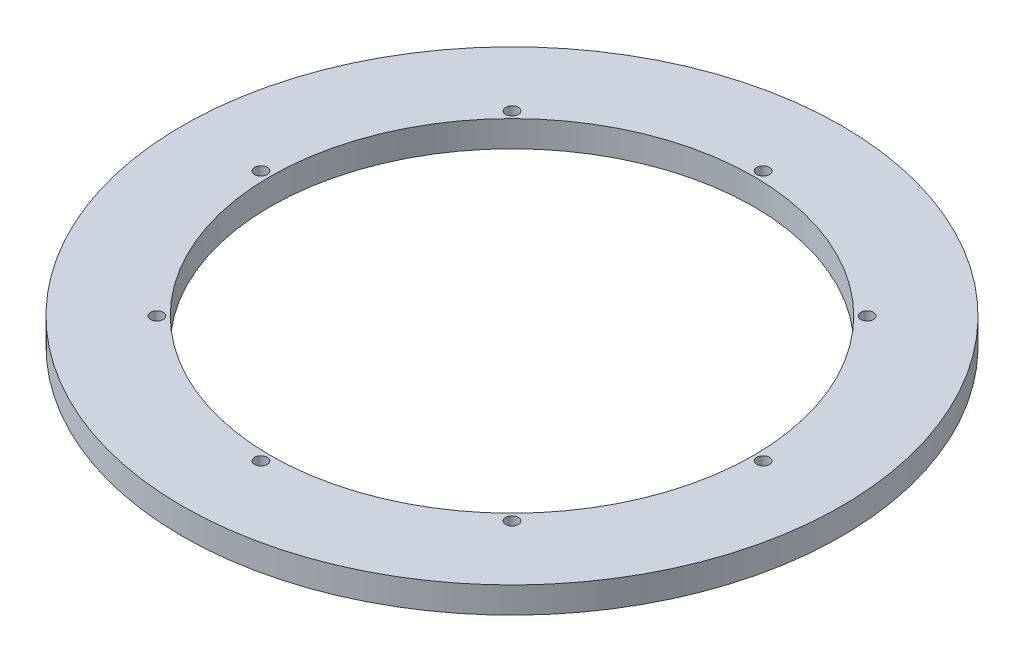
ISO-10303-21;
HEADER;
FILE_DESCRIPTION(('STEP AP214'),'2;1');
FILE_NAME('part.step','',(''),(''),'','','');
FILE_SCHEMA(('AUTOMOTIVE_DESIGN { 1 0 10303 214 1 1 1 1 }'));
ENDSEC;
DATA;
#1=APPLICATION_CONTEXT('core data for automotive mechanical design processes');
#2=APPLICATION_PROTOCOL_DEFINITION('international standard','automotive_design',2000,#1);
#3=PRODUCT_CONTEXT('',#1,'mechanical');
#4=PRODUCT('Part','Part','',(#3));
#5=PRODUCT_RELATED_PRODUCT_CATEGORY('part','',(#4));
#6=PRODUCT_DEFINITION_FORMATION('','',#4);
#7=PRODUCT_DEFINITION_CONTEXT('part definition',#1,'design');
#8=PRODUCT_DEFINITION('design','',#6,#7);
#9=PRODUCT_DEFINITION_SHAPE('','',#8);
#10=(LENGTH_UNIT() NAMED_UNIT(*) SI_UNIT(.MILLI.,.METRE.));
#11=(NAMED_UNIT(*) PLANE_ANGLE_UNIT() SI_UNIT($,.RADIAN.));
#12=(NAMED_UNIT(*) SI_UNIT($,.STERADIAN.) SOLID_ANGLE_UNIT());
#13=UNCERTAINTY_MEASURE_WITH_UNIT(LENGTH_MEASURE(1.E-05),#10,'distance_accuracy_value','');
#14=(GEOMETRIC_REPRESENTATION_CONTEXT(3) GLOBAL_UNCERTAINTY_ASSIGNED_CONTEXT((#13)) GLOBAL_UNIT_ASSIGNED_CONTEXT((#10,
#11,#12)) REPRESENTATION_CONTEXT('',''));
#15=CARTESIAN_POINT('',(0.,0.,0.));
#16=DIRECTION('',(0.,0.,1.));
#17=DIRECTION('',(1.,0.,0.));
#18=AXIS2_PLACEMENT_3D('',#15,#16,#17);
#19=CARTESIAN_POINT('',(0.,12.5,0.));
#20=DIRECTION('',(0.,1.,0.));
#21=DIRECTION('',(0.,0.,1.));
#22=AXIS2_PLACEMENT_3D('',#19,#20,#21);
#23=PLANE('',#22);
#24=CARTESIAN_POINT('',(-240.,12.5,-2.51386656396706E-12));
#25=DIRECTION('',(0.,1.,0.));
#26=DIRECTION('',(0.,0.,1.));
#27=AXIS2_PLACEMENT_3D('',#24,#25,#26);
#28=CIRCLE('',#27,6.);
#29=CARTESIAN_POINT('',(-240.,12.5,5.99999999999749));
#30=VERTEX_POINT('',#29);
#31=EDGE_CURVE('E82',#30,#30,#28,.T.);
#32=ORIENTED_EDGE('',*,*,#31,.F.);
#33=EDGE_LOOP('',(#32));
#34=FACE_BOUND('',#33,.T.);
#35=CARTESIAN_POINT('',(-1.6759110426447E-12,12.5,240.));
#36=DIRECTION('',(0.,1.,0.));
#37=DIRECTION('',(0.,0.,1.));
#38=AXIS2_PLACEMENT_3D('',#35,#36,#37);
#39=CIRCLE('',#38,6.00000000000001);
#40=CARTESIAN_POINT('',(-1.6759110426447E-12,12.5,246.));
#41=VERTEX_POINT('',#40);
#42=EDGE_CURVE('E70',#41,#41,#39,.T.);
#43=ORIENTED_EDGE('',*,*,#42,.F.);
#44=EDGE_LOOP('',(#43));
#45=FACE_BOUND('',#44,.T.);
#46=CARTESIAN_POINT('',(240.,12.5,8.37955521322352E-13));
#47=DIRECTION('',(0.,1.,0.));
#48=DIRECTION('',(0.,0.,1.));
#49=AXIS2_PLACEMENT_3D('',#46,#47,#48);
#50=CIRCLE('',#49,6.);
#51=CARTESIAN_POINT('',(240.,12.5,6.00000000000084));
#52=VERTEX_POINT('',#51);
#53=EDGE_CURVE('E58',#52,#52,#50,.T.);
#54=ORIENTED_EDGE('',*,*,#53,.F.);
#55=EDGE_LOOP('',(#54));
#56=FACE_BOUND('',#55,.T.);
#57=CARTESIAN_POINT('',(0.,12.5,-240.));
#58=DIRECTION('',(0.,1.,0.));
#59=DIRECTION('',(0.,0.,1.));
#60=AXIS2_PLACEMENT_3D('',#57,#58,#59);
#61=CIRCLE('',#60,6.);
#62=CARTESIAN_POINT('',(0.,12.5,-234.));
#63=VERTEX_POINT('',#62);
#64=EDGE_CURVE('E46',#63,#63,#61,.T.);
#65=ORIENTED_EDGE('',*,*,#64,.F.);
#66=EDGE_LOOP('',(#65));
#67=FACE_BOUND('',#66,.T.);
#68=CARTESIAN_POINT('',(0.,12.5,0.));
#69=DIRECTION('',(0.,1.,0.));
#70=DIRECTION('',(0.,0.,1.));
#71=AXIS2_PLACEMENT_3D('',#68,#69,#70);
#72=CIRCLE('',#71,315.);
#73=CARTESIAN_POINT('',(0.,12.5,315.));
#74=VERTEX_POINT('',#73);
#75=EDGE_CURVE('E10',#74,#74,#72,.T.);
#76=ORIENTED_EDGE('',*,*,#75,.T.);
#77=EDGE_LOOP('',(#76));
#78=FACE_BOUND('',#77,.T.);
#79=CARTESIAN_POINT('',(0.,12.5,0.));
#80=DIRECTION('',(0.,1.,0.));
#81=DIRECTION('',(0.,0.,1.));
#82=AXIS2_PLACEMENT_3D('',#79,#80,#81);
#83=CIRCLE('',#82,231.);
#84=CARTESIAN_POINT('',(0.,12.5,231.));
#85=VERTEX_POINT('',#84);
#86=EDGE_CURVE('E41',#85,#85,#83,.T.);
#87=ORIENTED_EDGE('',*,*,#86,.F.);
#88=EDGE_LOOP('',(#87));
#89=FACE_BOUND('',#88,.T.);
#90=CARTESIAN_POINT('',(169.705627484772,12.5,-169.705627484771));
#91=DIRECTION('',(0.,1.,0.));
#92=DIRECTION('',(0.,0.,1.));
#93=AXIS2_PLACEMENT_3D('',#90,#91,#92);
#94=CIRCLE('',#93,5.99999999999998);
#95=CARTESIAN_POINT('',(169.705627484772,12.5,-163.705627484771));
#96=VERTEX_POINT('',#95);
#97=EDGE_CURVE('E52',#96,#96,#94,.T.);
#98=ORIENTED_EDGE('',*,*,#97,.F.);
#99=EDGE_LOOP('',(#98));
#100=FACE_BOUND('',#99,.T.);
#101=CARTESIAN_POINT('',(169.70562748477,12.5,169.705627484772));
#102=DIRECTION('',(0.,1.,0.));
#103=DIRECTION('',(0.,0.,1.));
#104=AXIS2_PLACEMENT_3D('',#101,#102,#103);
#105=CIRCLE('',#104,5.99999999999998);
#106=CARTESIAN_POINT('',(169.70562748477,12.5,175.705627484772));
#107=VERTEX_POINT('',#106);
#108=EDGE_CURVE('E64',#107,#107,#105,.T.);
#109=ORIENTED_EDGE('',*,*,#108,.F.);
#110=EDGE_LOOP('',(#109));
#111=FACE_BOUND('',#110,.T.);
#112=CARTESIAN_POINT('',(-169.705627484773,12.5,169.70562748477));
#113=DIRECTION('',(0.,1.,0.));
#114=DIRECTION('',(0.,0.,1.));
#115=AXIS2_PLACEMENT_3D('',#112,#113,#114);
#116=CIRCLE('',#115,6.00000000000001);
#117=CARTESIAN_POINT('',(-169.705627484773,12.5,175.70562748477));
#118=VERTEX_POINT('',#117);
#119=EDGE_CURVE('E76',#118,#118,#116,.T.);
#120=ORIENTED_EDGE('',*,*,#119,.F.);
#121=EDGE_LOOP('',(#120));
#122=FACE_BOUND('',#121,.T.);
#123=CARTESIAN_POINT('',(-169.705627484769,12.5,-169.705627484773));
#124=DIRECTION('',(0.,1.,0.));
#125=DIRECTION('',(0.,0.,1.));
#126=AXIS2_PLACEMENT_3D('',#123,#124,#125);
#127=CIRCLE('',#126,6.00000000000001);
#128=CARTESIAN_POINT('',(-169.705627484769,12.5,-163.705627484773));
#129=VERTEX_POINT('',#128);
#130=EDGE_CURVE('E88',#129,#129,#127,.T.);
#131=ORIENTED_EDGE('',*,*,#130,.F.);
#132=EDGE_LOOP('',(#131));
#133=FACE_BOUND('',#132,.T.);
#134=ADVANCED_FACE('F30',(#34,#45,#56,#67,#78,#89,#100,#111,#122,#133),#23,.T.);
#135=CARTESIAN_POINT('',(0.,-12.5,0.));
#136=DIRECTION('',(0.,1.,0.));
#137=DIRECTION('',(0.,0.,1.));
#138=AXIS2_PLACEMENT_3D('',#135,#136,#137);
#139=PLANE('',#138);
#140=CARTESIAN_POINT('',(0.,-12.5,0.));
#141=DIRECTION('',(0.,1.,0.));
#142=DIRECTION('',(0.,0.,1.));
#143=AXIS2_PLACEMENT_3D('',#140,#141,#142);
#144=CIRCLE('',#143,315.);
#145=CARTESIAN_POINT('',(0.,-12.5,315.));
#146=VERTEX_POINT('',#145);
#147=EDGE_CURVE('E34',#146,#146,#144,.T.);
#148=ORIENTED_EDGE('',*,*,#147,.F.);
#149=EDGE_LOOP('',(#148));
#150=FACE_BOUND('',#149,.T.);
#151=CARTESIAN_POINT('',(0.,-12.5,0.));
#152=DIRECTION('',(0.,1.,0.));
#153=DIRECTION('',(0.,0.,1.));
#154=AXIS2_PLACEMENT_3D('',#151,#152,#153);
#155=CIRCLE('',#154,231.);
#156=CARTESIAN_POINT('',(0.,-12.5,231.));
#157=VERTEX_POINT('',#156);
#158=EDGE_CURVE('E43',#157,#157,#155,.T.);
#159=ORIENTED_EDGE('',*,*,#158,.T.);
#160=EDGE_LOOP('',(#159));
#161=FACE_BOUND('',#160,.T.);
#162=CARTESIAN_POINT('',(0.,-12.5,-240.));
#163=DIRECTION('',(0.,1.,0.));
#164=DIRECTION('',(0.,0.,1.));
#165=AXIS2_PLACEMENT_3D('',#162,#163,#164);
#166=CIRCLE('',#165,6.);
#167=CARTESIAN_POINT('',(0.,-12.5,-234.));
#168=VERTEX_POINT('',#167);
#169=EDGE_CURVE('E49',#168,#168,#166,.T.);
#170=ORIENTED_EDGE('',*,*,#169,.T.);
#171=EDGE_LOOP('',(#170));
#172=FACE_BOUND('',#171,.T.);
#173=CARTESIAN_POINT('',(169.705627484772,-12.5,-169.705627484771));
#174=DIRECTION('',(0.,1.,0.));
#175=DIRECTION('',(0.,0.,1.));
#176=AXIS2_PLACEMENT_3D('',#173,#174,#175);
#177=CIRCLE('',#176,5.99999999999998);
#178=CARTESIAN_POINT('',(169.705627484772,-12.5,-163.705627484771));
#179=VERTEX_POINT('',#178);
#180=EDGE_CURVE('E55',#179,#179,#177,.T.);
#181=ORIENTED_EDGE('',*,*,#180,.T.);
#182=EDGE_LOOP('',(#181));
#183=FACE_BOUND('',#182,.T.);
#184=CARTESIAN_POINT('',(240.,-12.5,8.37955521322352E-13));
#185=DIRECTION('',(0.,1.,0.));
#186=DIRECTION('',(0.,0.,1.));
#187=AXIS2_PLACEMENT_3D('',#184,#185,#186);
#188=CIRCLE('',#187,6.);
#189=CARTESIAN_POINT('',(240.,-12.5,6.00000000000084));
#190=VERTEX_POINT('',#189);
#191=EDGE_CURVE('E61',#190,#190,#188,.T.);
#192=ORIENTED_EDGE('',*,*,#191,.T.);
#193=EDGE_LOOP('',(#192));
#194=FACE_BOUND('',#193,.T.);
#195=CARTESIAN_POINT('',(169.70562748477,-12.5,169.705627484772));
#196=DIRECTION('',(0.,1.,0.));
#197=DIRECTION('',(0.,0.,1.));
#198=AXIS2_PLACEMENT_3D('',#195,#196,#197);
#199=CIRCLE('',#198,5.99999999999998);
#200=CARTESIAN_POINT('',(169.70562748477,-12.5,175.705627484772));
#201=VERTEX_POINT('',#200);
#202=EDGE_CURVE('E67',#201,#201,#199,.T.);
#203=ORIENTED_EDGE('',*,*,#202,.T.);
#204=EDGE_LOOP('',(#203));
#205=FACE_BOUND('',#204,.T.);
#206=CARTESIAN_POINT('',(-1.6759110426447E-12,-12.5,240.));
#207=DIRECTION('',(0.,1.,0.));
#208=DIRECTION('',(0.,0.,1.));
#209=AXIS2_PLACEMENT_3D('',#206,#207,#208);
#210=CIRCLE('',#209,6.00000000000001);
#211=CARTESIAN_POINT('',(-1.6759110426447E-12,-12.5,246.));
#212=VERTEX_POINT('',#211);
#213=EDGE_CURVE('E73',#212,#212,#210,.T.);
#214=ORIENTED_EDGE('',*,*,#213,.T.);
#215=EDGE_LOOP('',(#214));
#216=FACE_BOUND('',#215,.T.);
#217=CARTESIAN_POINT('',(-169.705627484773,-12.5,169.70562748477));
#218=DIRECTION('',(0.,1.,0.));
#219=DIRECTION('',(0.,0.,1.));
#220=AXIS2_PLACEMENT_3D('',#217,#218,#219);
#221=CIRCLE('',#220,6.00000000000001);
#222=CARTESIAN_POINT('',(-169.705627484773,-12.5,175.70562748477));
#223=VERTEX_POINT('',#222);
#224=EDGE_CURVE('E79',#223,#223,#221,.T.);
#225=ORIENTED_EDGE('',*,*,#224,.T.);
#226=EDGE_LOOP('',(#225));
#227=FACE_BOUND('',#226,.T.);
#228=CARTESIAN_POINT('',(-240.,-12.5,-2.51386656396706E-12));
#229=DIRECTION('',(0.,1.,0.));
#230=DIRECTION('',(0.,0.,1.));
#231=AXIS2_PLACEMENT_3D('',#228,#229,#230);
#232=CIRCLE('',#231,6.);
#233=CARTESIAN_POINT('',(-240.,-12.5,5.99999999999749));
#234=VERTEX_POINT('',#233);
#235=EDGE_CURVE('E85',#234,#234,#232,.T.);
#236=ORIENTED_EDGE('',*,*,#235,.T.);
#237=EDGE_LOOP('',(#236));
#238=FACE_BOUND('',#237,.T.);
#239=CARTESIAN_POINT('',(-169.705627484769,-12.5,-169.705627484773));
#240=DIRECTION('',(0.,1.,0.));
#241=DIRECTION('',(0.,0.,1.));
#242=AXIS2_PLACEMENT_3D('',#239,#240,#241);
#243=CIRCLE('',#242,6.00000000000001);
#244=CARTESIAN_POINT('',(-169.705627484769,-12.5,-163.705627484773));
#245=VERTEX_POINT('',#244);
#246=EDGE_CURVE('E91',#245,#245,#243,.T.);
#247=ORIENTED_EDGE('',*,*,#246,.T.);
#248=EDGE_LOOP('',(#247));
#249=FACE_BOUND('',#248,.T.);
#250=ADVANCED_FACE('F101',(#150,#161,#172,#183,#194,#205,#216,#227,#238,#249),#139,.F.);
#251=CARTESIAN_POINT('',(0.,12.5,0.));
#252=DIRECTION('',(0.,-1.,0.));
#253=DIRECTION('',(0.,0.,-1.));
#254=AXIS2_PLACEMENT_3D('',#251,#252,#253);
#255=CYLINDRICAL_SURFACE('',#254,315.);
#256=ORIENTED_EDGE('',*,*,#75,.F.);
#257=EDGE_LOOP('',(#256));
#258=FACE_BOUND('',#257,.T.);
#259=ORIENTED_EDGE('',*,*,#147,.T.);
#260=EDGE_LOOP('',(#259));
#261=FACE_BOUND('',#260,.T.);
#262=ADVANCED_FACE('F32',(#258,#261),#255,.T.);
#263=CARTESIAN_POINT('',(0.,12.5,0.));
#264=DIRECTION('',(0.,-1.,0.));
#265=DIRECTION('',(0.,0.,-1.));
#266=AXIS2_PLACEMENT_3D('',#263,#264,#265);
#267=CYLINDRICAL_SURFACE('',#266,231.);
#268=ORIENTED_EDGE('',*,*,#86,.T.);
#269=EDGE_LOOP('',(#268));
#270=FACE_BOUND('',#269,.T.);
#271=ORIENTED_EDGE('',*,*,#158,.F.);
#272=EDGE_LOOP('',(#271));
#273=FACE_BOUND('',#272,.T.);
#274=ADVANCED_FACE('F111',(#270,#273),#267,.F.);
#275=CARTESIAN_POINT('',(0.,12.5,-240.));
#276=DIRECTION('',(0.,-1.,0.));
#277=DIRECTION('',(0.,0.,-1.));
#278=AXIS2_PLACEMENT_3D('',#275,#276,#277);
#279=CYLINDRICAL_SURFACE('',#278,6.);
#280=ORIENTED_EDGE('',*,*,#64,.T.);
#281=EDGE_LOOP('',(#280));
#282=FACE_BOUND('',#281,.T.);
#283=ORIENTED_EDGE('',*,*,#169,.F.);
#284=EDGE_LOOP('',(#283));
#285=FACE_BOUND('',#284,.T.);
#286=ADVANCED_FACE('F114',(#282,#285),#279,.F.);
#287=CARTESIAN_POINT('',(169.705627484772,12.5,-169.705627484771));
#288=DIRECTION('',(0.,-1.,0.));
#289=DIRECTION('',(0.,0.,-1.));
#290=AXIS2_PLACEMENT_3D('',#287,#288,#289);
#291=CYLINDRICAL_SURFACE('',#290,5.99999999999998);
#292=ORIENTED_EDGE('',*,*,#97,.T.);
#293=EDGE_LOOP('',(#292));
#294=FACE_BOUND('',#293,.T.);
#295=ORIENTED_EDGE('',*,*,#180,.F.);
#296=EDGE_LOOP('',(#295));
#297=FACE_BOUND('',#296,.T.);
#298=ADVANCED_FACE('F118',(#294,#297),#291,.F.);
#299=CARTESIAN_POINT('',(240.,12.5,8.37955521322352E-13));
#300=DIRECTION('',(0.,-1.,0.));
#301=DIRECTION('',(0.,0.,-1.));
#302=AXIS2_PLACEMENT_3D('',#299,#300,#301);
#303=CYLINDRICAL_SURFACE('',#302,6.);
#304=ORIENTED_EDGE('',*,*,#53,.T.);
#305=EDGE_LOOP('',(#304));
#306=FACE_BOUND('',#305,.T.);
#307=ORIENTED_EDGE('',*,*,#191,.F.);
#308=EDGE_LOOP('',(#307));
#309=FACE_BOUND('',#308,.T.);
#310=ADVANCED_FACE('F122',(#306,#309),#303,.F.);
#311=CARTESIAN_POINT('',(169.70562748477,12.5,169.705627484772));
#312=DIRECTION('',(0.,-1.,0.));
#313=DIRECTION('',(0.,0.,-1.));
#314=AXIS2_PLACEMENT_3D('',#311,#312,#313);
#315=CYLINDRICAL_SURFACE('',#314,5.99999999999998);
#316=ORIENTED_EDGE('',*,*,#108,.T.);
#317=EDGE_LOOP('',(#316));
#318=FACE_BOUND('',#317,.T.);
#319=ORIENTED_EDGE('',*,*,#202,.F.);
#320=EDGE_LOOP('',(#319));
#321=FACE_BOUND('',#320,.T.);
#322=ADVANCED_FACE('F126',(#318,#321),#315,.F.);
#323=CARTESIAN_POINT('',(-1.6759110426447E-12,12.5,240.));
#324=DIRECTION('',(0.,-1.,0.));
#325=DIRECTION('',(0.,0.,-1.));
#326=AXIS2_PLACEMENT_3D('',#323,#324,#325);
#327=CYLINDRICAL_SURFACE('',#326,6.00000000000001);
#328=ORIENTED_EDGE('',*,*,#42,.T.);
#329=EDGE_LOOP('',(#328));
#330=FACE_BOUND('',#329,.T.);
#331=ORIENTED_EDGE('',*,*,#213,.F.);
#332=EDGE_LOOP('',(#331));
#333=FACE_BOUND('',#332,.T.);
#334=ADVANCED_FACE('F130',(#330,#333),#327,.F.);
#335=CARTESIAN_POINT('',(-169.705627484773,12.5,169.70562748477));
#336=DIRECTION('',(0.,-1.,0.));
#337=DIRECTION('',(0.,0.,-1.));
#338=AXIS2_PLACEMENT_3D('',#335,#336,#337);
#339=CYLINDRICAL_SURFACE('',#338,6.00000000000001);
#340=ORIENTED_EDGE('',*,*,#119,.T.);
#341=EDGE_LOOP('',(#340));
#342=FACE_BOUND('',#341,.T.);
#343=ORIENTED_EDGE('',*,*,#224,.F.);
#344=EDGE_LOOP('',(#343));
#345=FACE_BOUND('',#344,.T.);
#346=ADVANCED_FACE('F134',(#342,#345),#339,.F.);
#347=CARTESIAN_POINT('',(-240.,12.5,-2.51386656396706E-12));
#348=DIRECTION('',(0.,-1.,0.));
#349=DIRECTION('',(0.,0.,-1.));
#350=AXIS2_PLACEMENT_3D('',#347,#348,#349);
#351=CYLINDRICAL_SURFACE('',#350,6.);
#352=ORIENTED_EDGE('',*,*,#31,.T.);
#353=EDGE_LOOP('',(#352));
#354=FACE_BOUND('',#353,.T.);
#355=ORIENTED_EDGE('',*,*,#235,.F.);
#356=EDGE_LOOP('',(#355));
#357=FACE_BOUND('',#356,.T.);
#358=ADVANCED_FACE('F138',(#354,#357),#351,.F.);
#359=CARTESIAN_POINT('',(-169.705627484769,12.5,-169.705627484773));
#360=DIRECTION('',(0.,-1.,0.));
#361=DIRECTION('',(0.,0.,-1.));
#362=AXIS2_PLACEMENT_3D('',#359,#360,#361);
#363=CYLINDRICAL_SURFACE('',#362,6.00000000000001);
#364=ORIENTED_EDGE('',*,*,#130,.T.);
#365=EDGE_LOOP('',(#364));
#366=FACE_BOUND('',#365,.T.);
#367=ORIENTED_EDGE('',*,*,#246,.F.);
#368=EDGE_LOOP('',(#367));
#369=FACE_BOUND('',#368,.T.);
#370=ADVANCED_FACE('F97',(#366,#369),#363,.F.);
#371=CLOSED_SHELL('',(#134,#250,#262,#274,#286,#298,#310,#322,#334,#346,#358,#370));
#372=MANIFOLD_SOLID_BREP('B2',#371);
#373=ADVANCED_BREP_SHAPE_REPRESENTATION('',(#18,#372),#14);
#374=SHAPE_DEFINITION_REPRESENTATION(#9,#373);
ENDSEC;
END-ISO-10303-21;
